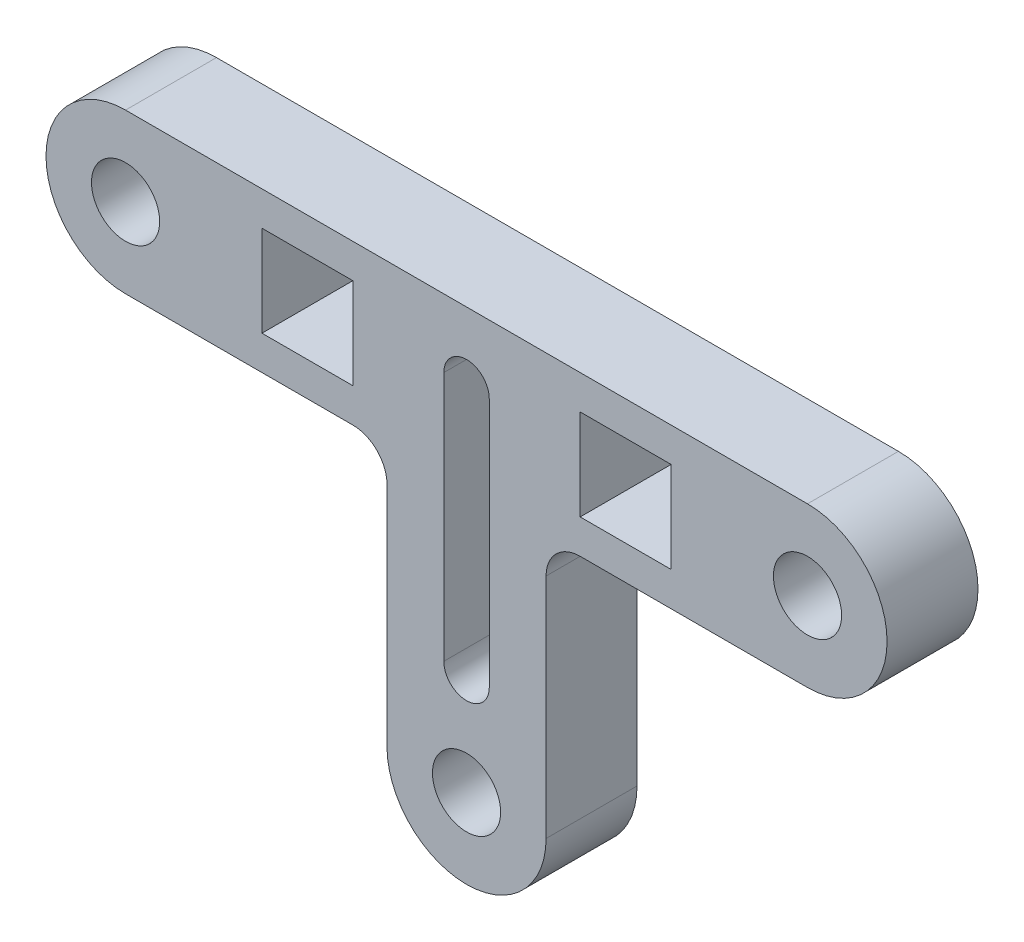
ISO-10303-21;
HEADER;
FILE_DESCRIPTION(('STEP AP214'),'2;1');
FILE_NAME('part.step','',(''),(''),'','','');
FILE_SCHEMA(('AUTOMOTIVE_DESIGN { 1 0 10303 214 1 1 1 1 }'));
ENDSEC;
DATA;
#1=APPLICATION_CONTEXT('core data for automotive mechanical design processes');
#2=APPLICATION_PROTOCOL_DEFINITION('international standard','automotive_design',2000,#1);
#3=PRODUCT_CONTEXT('',#1,'mechanical');
#4=PRODUCT('Part','Part','',(#3));
#5=PRODUCT_RELATED_PRODUCT_CATEGORY('part','',(#4));
#6=PRODUCT_DEFINITION_FORMATION('','',#4);
#7=PRODUCT_DEFINITION_CONTEXT('part definition',#1,'design');
#8=PRODUCT_DEFINITION('design','',#6,#7);
#9=PRODUCT_DEFINITION_SHAPE('','',#8);
#10=(LENGTH_UNIT() NAMED_UNIT(*) SI_UNIT(.MILLI.,.METRE.));
#11=(NAMED_UNIT(*) PLANE_ANGLE_UNIT() SI_UNIT($,.RADIAN.));
#12=(NAMED_UNIT(*) SI_UNIT($,.STERADIAN.) SOLID_ANGLE_UNIT());
#13=UNCERTAINTY_MEASURE_WITH_UNIT(LENGTH_MEASURE(1.E-05),#10,'distance_accuracy_value','');
#14=(GEOMETRIC_REPRESENTATION_CONTEXT(3) GLOBAL_UNCERTAINTY_ASSIGNED_CONTEXT((#13)) GLOBAL_UNIT_ASSIGNED_CONTEXT((#10,
#11,#12)) REPRESENTATION_CONTEXT('',''));
#15=CARTESIAN_POINT('',(0.,0.,0.));
#16=DIRECTION('',(0.,0.,1.));
#17=DIRECTION('',(1.,0.,0.));
#18=AXIS2_PLACEMENT_3D('',#15,#16,#17);
#19=CARTESIAN_POINT('',(0.,0.,4.));
#20=DIRECTION('',(0.,0.,-1.));
#21=DIRECTION('',(-1.,0.,0.));
#22=AXIS2_PLACEMENT_3D('',#19,#20,#21);
#23=PLANE('',#22);
#24=DIRECTION('',(0.,1.,0.));
#25=VECTOR('',#24,1.);
#26=CARTESIAN_POINT('',(1.,4.5,4.));
#27=LINE('',#26,#25);
#28=CARTESIAN_POINT('',(1.,4.5,4.));
#29=VERTEX_POINT('',#28);
#30=CARTESIAN_POINT('',(1.,15.5,4.));
#31=VERTEX_POINT('',#30);
#32=EDGE_CURVE('E207',#29,#31,#27,.T.);
#33=ORIENTED_EDGE('',*,*,#32,.F.);
#34=CARTESIAN_POINT('',(0.,4.5,4.));
#35=DIRECTION('',(0.,0.,1.));
#36=DIRECTION('',(1.,0.,0.));
#37=AXIS2_PLACEMENT_3D('',#34,#35,#36);
#38=CIRCLE('',#37,1.);
#39=CARTESIAN_POINT('',(-1.,4.5,4.));
#40=VERTEX_POINT('',#39);
#41=EDGE_CURVE('E54',#40,#29,#38,.T.);
#42=ORIENTED_EDGE('',*,*,#41,.F.);
#43=DIRECTION('',(0.,-1.,0.));
#44=VECTOR('',#43,1.);
#45=CARTESIAN_POINT('',(-1.,4.5,4.));
#46=LINE('',#45,#44);
#47=CARTESIAN_POINT('',(-1.,15.5,4.));
#48=VERTEX_POINT('',#47);
#49=EDGE_CURVE('E200',#48,#40,#46,.T.);
#50=ORIENTED_EDGE('',*,*,#49,.F.);
#51=CARTESIAN_POINT('',(0.,15.5,4.));
#52=DIRECTION('',(0.,0.,1.));
#53=DIRECTION('',(1.,0.,0.));
#54=AXIS2_PLACEMENT_3D('',#51,#52,#53);
#55=CIRCLE('',#54,1.);
#56=EDGE_CURVE('E214',#31,#48,#55,.T.);
#57=ORIENTED_EDGE('',*,*,#56,.F.);
#58=EDGE_LOOP('',(#33,#42,#50,#57));
#59=FACE_BOUND('',#58,.T.);
#60=CARTESIAN_POINT('',(0.,0.,4.));
#61=DIRECTION('',(0.,0.,1.));
#62=DIRECTION('',(1.,0.,0.));
#63=AXIS2_PLACEMENT_3D('',#60,#61,#62);
#64=CIRCLE('',#63,1.5);
#65=CARTESIAN_POINT('',(1.5,0.,4.));
#66=VERTEX_POINT('',#65);
#67=EDGE_CURVE('E254',#66,#66,#64,.T.);
#68=ORIENTED_EDGE('',*,*,#67,.F.);
#69=EDGE_LOOP('',(#68));
#70=FACE_BOUND('',#69,.T.);
#71=DIRECTION('',(0.,-1.,0.));
#72=VECTOR('',#71,1.);
#73=CARTESIAN_POINT('',(-9.,17.,4.));
#74=LINE('',#73,#72);
#75=CARTESIAN_POINT('',(-9.,17.,4.));
#76=VERTEX_POINT('',#75);
#77=CARTESIAN_POINT('',(-8.99999999999999,13.,4.));
#78=VERTEX_POINT('',#77);
#79=EDGE_CURVE('E260',#76,#78,#74,.T.);
#80=ORIENTED_EDGE('',*,*,#79,.F.);
#81=DIRECTION('',(-1.,0.,0.));
#82=VECTOR('',#81,1.);
#83=CARTESIAN_POINT('',(-5.00000000000001,17.,4.));
#84=LINE('',#83,#82);
#85=CARTESIAN_POINT('',(-5.00000000000001,17.,4.));
#86=VERTEX_POINT('',#85);
#87=EDGE_CURVE('E268',#86,#76,#84,.T.);
#88=ORIENTED_EDGE('',*,*,#87,.F.);
#89=DIRECTION('',(0.,1.,0.));
#90=VECTOR('',#89,1.);
#91=CARTESIAN_POINT('',(-5.00000000000001,17.,4.));
#92=LINE('',#91,#90);
#93=CARTESIAN_POINT('',(-5.00000000000004,13.,4.));
#94=VERTEX_POINT('',#93);
#95=EDGE_CURVE('E265',#94,#86,#92,.T.);
#96=ORIENTED_EDGE('',*,*,#95,.F.);
#97=DIRECTION('',(1.,0.,0.));
#98=VECTOR('',#97,1.);
#99=CARTESIAN_POINT('',(-5.00000000000004,13.,4.));
#100=LINE('',#99,#98);
#101=EDGE_CURVE('E262',#78,#94,#100,.T.);
#102=ORIENTED_EDGE('',*,*,#101,.F.);
#103=EDGE_LOOP('',(#80,#88,#96,#102));
#104=FACE_BOUND('',#103,.T.);
#105=CARTESIAN_POINT('',(0.,0.,4.));
#106=DIRECTION('',(0.,0.,1.));
#107=DIRECTION('',(-1.,0.,0.));
#108=AXIS2_PLACEMENT_3D('',#105,#106,#107);
#109=CIRCLE('',#108,3.5);
#110=CARTESIAN_POINT('',(-3.5,0.,4.));
#111=VERTEX_POINT('',#110);
#112=CARTESIAN_POINT('',(3.5,0.,4.));
#113=VERTEX_POINT('',#112);
#114=EDGE_CURVE('E303',#111,#113,#109,.T.);
#115=ORIENTED_EDGE('',*,*,#114,.T.);
#116=DIRECTION('',(0.,1.,0.));
#117=VECTOR('',#116,1.);
#118=CARTESIAN_POINT('',(3.5,0.,4.));
#119=LINE('',#118,#117);
#120=CARTESIAN_POINT('',(3.5,10.,4.));
#121=VERTEX_POINT('',#120);
#122=EDGE_CURVE('E306',#113,#121,#119,.T.);
#123=ORIENTED_EDGE('',*,*,#122,.T.);
#124=CARTESIAN_POINT('',(5.,10.,4.));
#125=DIRECTION('',(0.,0.,-1.));
#126=DIRECTION('',(1.,0.,0.));
#127=AXIS2_PLACEMENT_3D('',#124,#125,#126);
#128=CIRCLE('',#127,1.5);
#129=CARTESIAN_POINT('',(5.,11.5,4.));
#130=VERTEX_POINT('',#129);
#131=EDGE_CURVE('E309',#121,#130,#128,.T.);
#132=ORIENTED_EDGE('',*,*,#131,.T.);
#133=DIRECTION('',(1.,0.,0.));
#134=VECTOR('',#133,1.);
#135=CARTESIAN_POINT('',(15.,11.5,4.));
#136=LINE('',#135,#134);
#137=CARTESIAN_POINT('',(15.,11.5,4.));
#138=VERTEX_POINT('',#137);
#139=EDGE_CURVE('E311',#130,#138,#136,.T.);
#140=ORIENTED_EDGE('',*,*,#139,.T.);
#141=CARTESIAN_POINT('',(15.,15.,4.));
#142=DIRECTION('',(0.,0.,1.));
#143=DIRECTION('',(-1.,0.,0.));
#144=AXIS2_PLACEMENT_3D('',#141,#142,#143);
#145=CIRCLE('',#144,3.5);
#146=CARTESIAN_POINT('',(15.,18.5,4.));
#147=VERTEX_POINT('',#146);
#148=EDGE_CURVE('E313',#138,#147,#145,.T.);
#149=ORIENTED_EDGE('',*,*,#148,.T.);
#150=DIRECTION('',(-1.,0.,0.));
#151=VECTOR('',#150,1.);
#152=CARTESIAN_POINT('',(-15.,18.5,4.));
#153=LINE('',#152,#151);
#154=CARTESIAN_POINT('',(-15.,18.5,4.));
#155=VERTEX_POINT('',#154);
#156=EDGE_CURVE('E315',#147,#155,#153,.T.);
#157=ORIENTED_EDGE('',*,*,#156,.T.);
#158=CARTESIAN_POINT('',(-15.,15.,4.));
#159=DIRECTION('',(0.,0.,1.));
#160=DIRECTION('',(-1.,0.,0.));
#161=AXIS2_PLACEMENT_3D('',#158,#159,#160);
#162=CIRCLE('',#161,3.5);
#163=CARTESIAN_POINT('',(-15.,11.5,4.));
#164=VERTEX_POINT('',#163);
#165=EDGE_CURVE('E317',#155,#164,#162,.T.);
#166=ORIENTED_EDGE('',*,*,#165,.T.);
#167=DIRECTION('',(1.,0.,0.));
#168=VECTOR('',#167,1.);
#169=CARTESIAN_POINT('',(-5.,11.5,4.));
#170=LINE('',#169,#168);
#171=CARTESIAN_POINT('',(-5.,11.5,4.));
#172=VERTEX_POINT('',#171);
#173=EDGE_CURVE('E319',#164,#172,#170,.T.);
#174=ORIENTED_EDGE('',*,*,#173,.T.);
#175=CARTESIAN_POINT('',(-5.,10.,4.));
#176=DIRECTION('',(0.,0.,-1.));
#177=DIRECTION('',(1.,0.,0.));
#178=AXIS2_PLACEMENT_3D('',#175,#176,#177);
#179=CIRCLE('',#178,1.5);
#180=CARTESIAN_POINT('',(-3.5,10.,4.));
#181=VERTEX_POINT('',#180);
#182=EDGE_CURVE('E321',#172,#181,#179,.T.);
#183=ORIENTED_EDGE('',*,*,#182,.T.);
#184=DIRECTION('',(0.,-1.,0.));
#185=VECTOR('',#184,1.);
#186=CARTESIAN_POINT('',(-3.5,0.,4.));
#187=LINE('',#186,#185);
#188=EDGE_CURVE('E323',#181,#111,#187,.T.);
#189=ORIENTED_EDGE('',*,*,#188,.T.);
#190=EDGE_LOOP('',(#115,#123,#132,#140,#149,#157,#166,#174,#183,#189));
#191=FACE_BOUND('',#190,.T.);
#192=CARTESIAN_POINT('',(-15.,15.,4.));
#193=DIRECTION('',(0.,0.,1.));
#194=DIRECTION('',(1.,0.,0.));
#195=AXIS2_PLACEMENT_3D('',#192,#193,#194);
#196=CIRCLE('',#195,1.5);
#197=CARTESIAN_POINT('',(-13.5,15.,4.));
#198=VERTEX_POINT('',#197);
#199=EDGE_CURVE('E297',#198,#198,#196,.T.);
#200=ORIENTED_EDGE('',*,*,#199,.F.);
#201=EDGE_LOOP('',(#200));
#202=FACE_BOUND('',#201,.T.);
#203=CARTESIAN_POINT('',(15.,15.,4.));
#204=DIRECTION('',(0.,0.,1.));
#205=DIRECTION('',(1.,0.,0.));
#206=AXIS2_PLACEMENT_3D('',#203,#204,#205);
#207=CIRCLE('',#206,1.5);
#208=CARTESIAN_POINT('',(16.5,15.,4.));
#209=VERTEX_POINT('',#208);
#210=EDGE_CURVE('E291',#209,#209,#207,.T.);
#211=ORIENTED_EDGE('',*,*,#210,.F.);
#212=EDGE_LOOP('',(#211));
#213=FACE_BOUND('',#212,.T.);
#214=DIRECTION('',(0.,-1.,0.));
#215=VECTOR('',#214,1.);
#216=CARTESIAN_POINT('',(5.00000000000002,17.,4.));
#217=LINE('',#216,#215);
#218=CARTESIAN_POINT('',(5.00000000000002,17.,4.));
#219=VERTEX_POINT('',#218);
#220=CARTESIAN_POINT('',(5.00000000000002,13.,4.));
#221=VERTEX_POINT('',#220);
#222=EDGE_CURVE('E223',#219,#221,#217,.T.);
#223=ORIENTED_EDGE('',*,*,#222,.F.);
#224=DIRECTION('',(-1.,0.,0.));
#225=VECTOR('',#224,1.);
#226=CARTESIAN_POINT('',(9.00000000000001,17.,4.));
#227=LINE('',#226,#225);
#228=CARTESIAN_POINT('',(9.00000000000001,17.,4.));
#229=VERTEX_POINT('',#228);
#230=EDGE_CURVE('E231',#229,#219,#227,.T.);
#231=ORIENTED_EDGE('',*,*,#230,.F.);
#232=DIRECTION('',(0.,1.,0.));
#233=VECTOR('',#232,1.);
#234=CARTESIAN_POINT('',(9.00000000000001,17.,4.));
#235=LINE('',#234,#233);
#236=CARTESIAN_POINT('',(9.00000000000002,13.,4.));
#237=VERTEX_POINT('',#236);
#238=EDGE_CURVE('E228',#237,#229,#235,.T.);
#239=ORIENTED_EDGE('',*,*,#238,.F.);
#240=DIRECTION('',(1.,0.,0.));
#241=VECTOR('',#240,1.);
#242=CARTESIAN_POINT('',(9.00000000000002,13.,4.));
#243=LINE('',#242,#241);
#244=EDGE_CURVE('E225',#221,#237,#243,.T.);
#245=ORIENTED_EDGE('',*,*,#244,.F.);
#246=EDGE_LOOP('',(#223,#231,#239,#245));
#247=FACE_BOUND('',#246,.T.);
#248=ADVANCED_FACE('F39',(#59,#70,#104,#191,#202,#213,#247),#23,.F.);
#249=CARTESIAN_POINT('',(0.,0.,0.));
#250=DIRECTION('',(0.,0.,-1.));
#251=DIRECTION('',(-1.,0.,0.));
#252=AXIS2_PLACEMENT_3D('',#249,#250,#251);
#253=PLANE('',#252);
#254=CARTESIAN_POINT('',(0.,4.5,0.));
#255=DIRECTION('',(0.,0.,-1.));
#256=DIRECTION('',(-1.,0.,0.));
#257=AXIS2_PLACEMENT_3D('',#254,#255,#256);
#258=CIRCLE('',#257,1.);
#259=CARTESIAN_POINT('',(-1.,4.5,0.));
#260=VERTEX_POINT('',#259);
#261=CARTESIAN_POINT('',(1.,4.5,0.));
#262=VERTEX_POINT('',#261);
#263=EDGE_CURVE('E198',#260,#262,#258,.F.);
#264=ORIENTED_EDGE('',*,*,#263,.T.);
#265=DIRECTION('',(0.,1.,0.));
#266=VECTOR('',#265,1.);
#267=CARTESIAN_POINT('',(1.,4.5,0.));
#268=LINE('',#267,#266);
#269=CARTESIAN_POINT('',(1.,15.5,0.));
#270=VERTEX_POINT('',#269);
#271=EDGE_CURVE('E187',#262,#270,#268,.T.);
#272=ORIENTED_EDGE('',*,*,#271,.T.);
#273=CARTESIAN_POINT('',(0.,15.5,0.));
#274=DIRECTION('',(0.,0.,-1.));
#275=DIRECTION('',(-1.,0.,0.));
#276=AXIS2_PLACEMENT_3D('',#273,#274,#275);
#277=CIRCLE('',#276,1.);
#278=CARTESIAN_POINT('',(-1.,15.5,0.));
#279=VERTEX_POINT('',#278);
#280=EDGE_CURVE('E209',#270,#279,#277,.F.);
#281=ORIENTED_EDGE('',*,*,#280,.T.);
#282=DIRECTION('',(0.,-1.,0.));
#283=VECTOR('',#282,1.);
#284=CARTESIAN_POINT('',(-1.,4.5,0.));
#285=LINE('',#284,#283);
#286=EDGE_CURVE('E205',#279,#260,#285,.T.);
#287=ORIENTED_EDGE('',*,*,#286,.T.);
#288=EDGE_LOOP('',(#264,#272,#281,#287));
#289=FACE_BOUND('',#288,.T.);
#290=DIRECTION('',(-1.,0.,0.));
#291=VECTOR('',#290,1.);
#292=CARTESIAN_POINT('',(-5.00000000000001,17.,0.));
#293=LINE('',#292,#291);
#294=CARTESIAN_POINT('',(-5.00000000000001,17.,0.));
#295=VERTEX_POINT('',#294);
#296=CARTESIAN_POINT('',(-9.,17.,0.));
#297=VERTEX_POINT('',#296);
#298=EDGE_CURVE('E263',#295,#297,#293,.T.);
#299=ORIENTED_EDGE('',*,*,#298,.T.);
#300=DIRECTION('',(0.,-1.,0.));
#301=VECTOR('',#300,1.);
#302=CARTESIAN_POINT('',(-9.,17.,0.));
#303=LINE('',#302,#301);
#304=CARTESIAN_POINT('',(-8.99999999999999,13.,0.));
#305=VERTEX_POINT('',#304);
#306=EDGE_CURVE('E257',#297,#305,#303,.T.);
#307=ORIENTED_EDGE('',*,*,#306,.T.);
#308=DIRECTION('',(1.,0.,0.));
#309=VECTOR('',#308,1.);
#310=CARTESIAN_POINT('',(-5.00000000000004,13.,0.));
#311=LINE('',#310,#309);
#312=CARTESIAN_POINT('',(-5.00000000000004,13.,0.));
#313=VERTEX_POINT('',#312);
#314=EDGE_CURVE('E273',#305,#313,#311,.T.);
#315=ORIENTED_EDGE('',*,*,#314,.T.);
#316=DIRECTION('',(0.,1.,0.));
#317=VECTOR('',#316,1.);
#318=CARTESIAN_POINT('',(-5.00000000000001,17.,0.));
#319=LINE('',#318,#317);
#320=EDGE_CURVE('E276',#313,#295,#319,.T.);
#321=ORIENTED_EDGE('',*,*,#320,.T.);
#322=EDGE_LOOP('',(#299,#307,#315,#321));
#323=FACE_BOUND('',#322,.T.);
#324=CARTESIAN_POINT('',(15.,15.,0.));
#325=DIRECTION('',(0.,0.,1.));
#326=DIRECTION('',(1.,0.,0.));
#327=AXIS2_PLACEMENT_3D('',#324,#325,#326);
#328=CIRCLE('',#327,1.5);
#329=CARTESIAN_POINT('',(16.5,15.,0.));
#330=VERTEX_POINT('',#329);
#331=EDGE_CURVE('E290',#330,#330,#328,.T.);
#332=ORIENTED_EDGE('',*,*,#331,.T.);
#333=EDGE_LOOP('',(#332));
#334=FACE_BOUND('',#333,.T.);
#335=CARTESIAN_POINT('',(0.,0.,0.));
#336=DIRECTION('',(0.,0.,1.));
#337=DIRECTION('',(-1.,0.,0.));
#338=AXIS2_PLACEMENT_3D('',#335,#336,#337);
#339=CIRCLE('',#338,3.5);
#340=CARTESIAN_POINT('',(-3.5,0.,0.));
#341=VERTEX_POINT('',#340);
#342=CARTESIAN_POINT('',(3.5,0.,0.));
#343=VERTEX_POINT('',#342);
#344=EDGE_CURVE('E300',#341,#343,#339,.T.);
#345=ORIENTED_EDGE('',*,*,#344,.F.);
#346=DIRECTION('',(0.,-1.,0.));
#347=VECTOR('',#346,1.);
#348=CARTESIAN_POINT('',(-3.5,0.,0.));
#349=LINE('',#348,#347);
#350=CARTESIAN_POINT('',(-3.5,10.,0.));
#351=VERTEX_POINT('',#350);
#352=EDGE_CURVE('E307',#351,#341,#349,.T.);
#353=ORIENTED_EDGE('',*,*,#352,.F.);
#354=CARTESIAN_POINT('',(-5.,10.,0.));
#355=DIRECTION('',(0.,0.,-1.));
#356=DIRECTION('',(1.,0.,0.));
#357=AXIS2_PLACEMENT_3D('',#354,#355,#356);
#358=CIRCLE('',#357,1.5);
#359=CARTESIAN_POINT('',(-5.,11.5,0.));
#360=VERTEX_POINT('',#359);
#361=EDGE_CURVE('E342',#360,#351,#358,.T.);
#362=ORIENTED_EDGE('',*,*,#361,.F.);
#363=DIRECTION('',(1.,0.,0.));
#364=VECTOR('',#363,1.);
#365=CARTESIAN_POINT('',(-5.,11.5,0.));
#366=LINE('',#365,#364);
#367=CARTESIAN_POINT('',(-15.,11.5,0.));
#368=VERTEX_POINT('',#367);
#369=EDGE_CURVE('E340',#368,#360,#366,.T.);
#370=ORIENTED_EDGE('',*,*,#369,.F.);
#371=CARTESIAN_POINT('',(-15.,15.,0.));
#372=DIRECTION('',(0.,0.,1.));
#373=DIRECTION('',(-1.,0.,0.));
#374=AXIS2_PLACEMENT_3D('',#371,#372,#373);
#375=CIRCLE('',#374,3.5);
#376=CARTESIAN_POINT('',(-15.,18.5,0.));
#377=VERTEX_POINT('',#376);
#378=EDGE_CURVE('E338',#377,#368,#375,.T.);
#379=ORIENTED_EDGE('',*,*,#378,.F.);
#380=DIRECTION('',(-1.,0.,0.));
#381=VECTOR('',#380,1.);
#382=CARTESIAN_POINT('',(-15.,18.5,0.));
#383=LINE('',#382,#381);
#384=CARTESIAN_POINT('',(15.,18.5,0.));
#385=VERTEX_POINT('',#384);
#386=EDGE_CURVE('E336',#385,#377,#383,.T.);
#387=ORIENTED_EDGE('',*,*,#386,.F.);
#388=CARTESIAN_POINT('',(15.,15.,0.));
#389=DIRECTION('',(0.,0.,1.));
#390=DIRECTION('',(-1.,0.,0.));
#391=AXIS2_PLACEMENT_3D('',#388,#389,#390);
#392=CIRCLE('',#391,3.5);
#393=CARTESIAN_POINT('',(15.,11.5,0.));
#394=VERTEX_POINT('',#393);
#395=EDGE_CURVE('E334',#394,#385,#392,.T.);
#396=ORIENTED_EDGE('',*,*,#395,.F.);
#397=DIRECTION('',(1.,0.,0.));
#398=VECTOR('',#397,1.);
#399=CARTESIAN_POINT('',(15.,11.5,0.));
#400=LINE('',#399,#398);
#401=CARTESIAN_POINT('',(5.,11.5,0.));
#402=VERTEX_POINT('',#401);
#403=EDGE_CURVE('E332',#402,#394,#400,.T.);
#404=ORIENTED_EDGE('',*,*,#403,.F.);
#405=CARTESIAN_POINT('',(5.,10.,0.));
#406=DIRECTION('',(0.,0.,-1.));
#407=DIRECTION('',(1.,0.,0.));
#408=AXIS2_PLACEMENT_3D('',#405,#406,#407);
#409=CIRCLE('',#408,1.5);
#410=CARTESIAN_POINT('',(3.5,10.,0.));
#411=VERTEX_POINT('',#410);
#412=EDGE_CURVE('E330',#411,#402,#409,.T.);
#413=ORIENTED_EDGE('',*,*,#412,.F.);
#414=DIRECTION('',(0.,1.,0.));
#415=VECTOR('',#414,1.);
#416=CARTESIAN_POINT('',(3.5,0.,0.));
#417=LINE('',#416,#415);
#418=EDGE_CURVE('E328',#343,#411,#417,.T.);
#419=ORIENTED_EDGE('',*,*,#418,.F.);
#420=EDGE_LOOP('',(#345,#353,#362,#370,#379,#387,#396,#404,#413,#419));
#421=FACE_BOUND('',#420,.T.);
#422=CARTESIAN_POINT('',(-15.,15.,0.));
#423=DIRECTION('',(0.,0.,1.));
#424=DIRECTION('',(1.,0.,0.));
#425=AXIS2_PLACEMENT_3D('',#422,#423,#424);
#426=CIRCLE('',#425,1.5);
#427=CARTESIAN_POINT('',(-13.5,15.,0.));
#428=VERTEX_POINT('',#427);
#429=EDGE_CURVE('E294',#428,#428,#426,.T.);
#430=ORIENTED_EDGE('',*,*,#429,.T.);
#431=EDGE_LOOP('',(#430));
#432=FACE_BOUND('',#431,.T.);
#433=CARTESIAN_POINT('',(0.,0.,0.));
#434=DIRECTION('',(0.,0.,1.));
#435=DIRECTION('',(1.,0.,0.));
#436=AXIS2_PLACEMENT_3D('',#433,#434,#435);
#437=CIRCLE('',#436,1.5);
#438=CARTESIAN_POINT('',(1.5,0.,0.));
#439=VERTEX_POINT('',#438);
#440=EDGE_CURVE('E253',#439,#439,#437,.T.);
#441=ORIENTED_EDGE('',*,*,#440,.T.);
#442=EDGE_LOOP('',(#441));
#443=FACE_BOUND('',#442,.T.);
#444=DIRECTION('',(-1.,0.,0.));
#445=VECTOR('',#444,1.);
#446=CARTESIAN_POINT('',(9.00000000000001,17.,0.));
#447=LINE('',#446,#445);
#448=CARTESIAN_POINT('',(9.00000000000001,17.,0.));
#449=VERTEX_POINT('',#448);
#450=CARTESIAN_POINT('',(5.00000000000002,17.,0.));
#451=VERTEX_POINT('',#450);
#452=EDGE_CURVE('E226',#449,#451,#447,.T.);
#453=ORIENTED_EDGE('',*,*,#452,.T.);
#454=DIRECTION('',(0.,-1.,0.));
#455=VECTOR('',#454,1.);
#456=CARTESIAN_POINT('',(5.00000000000002,17.,0.));
#457=LINE('',#456,#455);
#458=CARTESIAN_POINT('',(5.00000000000002,13.,0.));
#459=VERTEX_POINT('',#458);
#460=EDGE_CURVE('E194',#451,#459,#457,.T.);
#461=ORIENTED_EDGE('',*,*,#460,.T.);
#462=DIRECTION('',(1.,0.,0.));
#463=VECTOR('',#462,1.);
#464=CARTESIAN_POINT('',(9.00000000000002,13.,0.));
#465=LINE('',#464,#463);
#466=CARTESIAN_POINT('',(9.00000000000002,13.,0.));
#467=VERTEX_POINT('',#466);
#468=EDGE_CURVE('E236',#459,#467,#465,.T.);
#469=ORIENTED_EDGE('',*,*,#468,.T.);
#470=DIRECTION('',(0.,1.,0.));
#471=VECTOR('',#470,1.);
#472=CARTESIAN_POINT('',(9.00000000000001,17.,0.));
#473=LINE('',#472,#471);
#474=EDGE_CURVE('E239',#467,#449,#473,.T.);
#475=ORIENTED_EDGE('',*,*,#474,.T.);
#476=EDGE_LOOP('',(#453,#461,#469,#475));
#477=FACE_BOUND('',#476,.T.);
#478=ADVANCED_FACE('F203',(#289,#323,#334,#421,#432,#443,#477),#253,.T.);
#479=CARTESIAN_POINT('',(0.,0.,4.));
#480=DIRECTION('',(0.,0.,-1.));
#481=DIRECTION('',(-1.,0.,0.));
#482=AXIS2_PLACEMENT_3D('',#479,#480,#481);
#483=CYLINDRICAL_SURFACE('',#482,3.5);
#484=ORIENTED_EDGE('',*,*,#344,.T.);
#485=DIRECTION('',(0.,0.,-1.));
#486=VECTOR('',#485,1.);
#487=CARTESIAN_POINT('',(3.5,0.,4.));
#488=LINE('',#487,#486);
#489=EDGE_CURVE('E11',#113,#343,#488,.T.);
#490=ORIENTED_EDGE('',*,*,#489,.F.);
#491=ORIENTED_EDGE('',*,*,#114,.F.);
#492=DIRECTION('',(0.,0.,-1.));
#493=VECTOR('',#492,1.);
#494=CARTESIAN_POINT('',(-3.5,0.,4.));
#495=LINE('',#494,#493);
#496=EDGE_CURVE('E325',#111,#341,#495,.T.);
#497=ORIENTED_EDGE('',*,*,#496,.T.);
#498=EDGE_LOOP('',(#484,#490,#491,#497));
#499=FACE_BOUND('',#498,.T.);
#500=ADVANCED_FACE('F41',(#499),#483,.T.);
#501=CARTESIAN_POINT('',(3.5,0.,4.));
#502=DIRECTION('',(-1.,0.,0.));
#503=DIRECTION('',(0.,0.,1.));
#504=AXIS2_PLACEMENT_3D('',#501,#502,#503);
#505=PLANE('',#504);
#506=ORIENTED_EDGE('',*,*,#418,.T.);
#507=DIRECTION('',(0.,0.,-1.));
#508=VECTOR('',#507,1.);
#509=CARTESIAN_POINT('',(3.5,10.,4.));
#510=LINE('',#509,#508);
#511=EDGE_CURVE('E47',#121,#411,#510,.T.);
#512=ORIENTED_EDGE('',*,*,#511,.F.);
#513=ORIENTED_EDGE('',*,*,#122,.F.);
#514=ORIENTED_EDGE('',*,*,#489,.T.);
#515=EDGE_LOOP('',(#506,#512,#513,#514));
#516=FACE_BOUND('',#515,.T.);
#517=ADVANCED_FACE('F395',(#516),#505,.F.);
#518=CARTESIAN_POINT('',(5.,10.,4.));
#519=DIRECTION('',(0.,0.,-1.));
#520=DIRECTION('',(-1.,0.,0.));
#521=AXIS2_PLACEMENT_3D('',#518,#519,#520);
#522=CYLINDRICAL_SURFACE('',#521,1.5);
#523=ORIENTED_EDGE('',*,*,#412,.T.);
#524=DIRECTION('',(0.,0.,-1.));
#525=VECTOR('',#524,1.);
#526=CARTESIAN_POINT('',(5.,11.5,4.));
#527=LINE('',#526,#525);
#528=EDGE_CURVE('E365',#130,#402,#527,.T.);
#529=ORIENTED_EDGE('',*,*,#528,.F.);
#530=ORIENTED_EDGE('',*,*,#131,.F.);
#531=ORIENTED_EDGE('',*,*,#511,.T.);
#532=EDGE_LOOP('',(#523,#529,#530,#531));
#533=FACE_BOUND('',#532,.T.);
#534=ADVANCED_FACE('F372',(#533),#522,.F.);
#535=CARTESIAN_POINT('',(15.,11.5,4.));
#536=DIRECTION('',(0.,1.,0.));
#537=DIRECTION('',(-1.,0.,0.));
#538=AXIS2_PLACEMENT_3D('',#535,#536,#537);
#539=PLANE('',#538);
#540=ORIENTED_EDGE('',*,*,#403,.T.);
#541=DIRECTION('',(0.,0.,-1.));
#542=VECTOR('',#541,1.);
#543=CARTESIAN_POINT('',(15.,11.5,4.));
#544=LINE('',#543,#542);
#545=EDGE_CURVE('E362',#138,#394,#544,.T.);
#546=ORIENTED_EDGE('',*,*,#545,.F.);
#547=ORIENTED_EDGE('',*,*,#139,.F.);
#548=ORIENTED_EDGE('',*,*,#528,.T.);
#549=EDGE_LOOP('',(#540,#546,#547,#548));
#550=FACE_BOUND('',#549,.T.);
#551=ADVANCED_FACE('F383',(#550),#539,.F.);
#552=CARTESIAN_POINT('',(15.,15.,4.));
#553=DIRECTION('',(0.,0.,-1.));
#554=DIRECTION('',(-1.,0.,0.));
#555=AXIS2_PLACEMENT_3D('',#552,#553,#554);
#556=CYLINDRICAL_SURFACE('',#555,3.5);
#557=ORIENTED_EDGE('',*,*,#395,.T.);
#558=DIRECTION('',(0.,0.,-1.));
#559=VECTOR('',#558,1.);
#560=CARTESIAN_POINT('',(15.,18.5,4.));
#561=LINE('',#560,#559);
#562=EDGE_CURVE('E359',#147,#385,#561,.T.);
#563=ORIENTED_EDGE('',*,*,#562,.F.);
#564=ORIENTED_EDGE('',*,*,#148,.F.);
#565=ORIENTED_EDGE('',*,*,#545,.T.);
#566=EDGE_LOOP('',(#557,#563,#564,#565));
#567=FACE_BOUND('',#566,.T.);
#568=ADVANCED_FACE('F387',(#567),#556,.T.);
#569=CARTESIAN_POINT('',(-15.,18.5,4.));
#570=DIRECTION('',(0.,-1.,0.));
#571=DIRECTION('',(0.,0.,-1.));
#572=AXIS2_PLACEMENT_3D('',#569,#570,#571);
#573=PLANE('',#572);
#574=ORIENTED_EDGE('',*,*,#386,.T.);
#575=DIRECTION('',(0.,0.,-1.));
#576=VECTOR('',#575,1.);
#577=CARTESIAN_POINT('',(-15.,18.5,4.));
#578=LINE('',#577,#576);
#579=EDGE_CURVE('E356',#155,#377,#578,.T.);
#580=ORIENTED_EDGE('',*,*,#579,.F.);
#581=ORIENTED_EDGE('',*,*,#156,.F.);
#582=ORIENTED_EDGE('',*,*,#562,.T.);
#583=EDGE_LOOP('',(#574,#580,#581,#582));
#584=FACE_BOUND('',#583,.T.);
#585=ADVANCED_FACE('F418',(#584),#573,.F.);
#586=CARTESIAN_POINT('',(-15.,15.,4.));
#587=DIRECTION('',(0.,0.,-1.));
#588=DIRECTION('',(-1.,0.,0.));
#589=AXIS2_PLACEMENT_3D('',#586,#587,#588);
#590=CYLINDRICAL_SURFACE('',#589,3.5);
#591=ORIENTED_EDGE('',*,*,#378,.T.);
#592=DIRECTION('',(0.,0.,-1.));
#593=VECTOR('',#592,1.);
#594=CARTESIAN_POINT('',(-15.,11.5,4.));
#595=LINE('',#594,#593);
#596=EDGE_CURVE('E353',#164,#368,#595,.T.);
#597=ORIENTED_EDGE('',*,*,#596,.F.);
#598=ORIENTED_EDGE('',*,*,#165,.F.);
#599=ORIENTED_EDGE('',*,*,#579,.T.);
#600=EDGE_LOOP('',(#591,#597,#598,#599));
#601=FACE_BOUND('',#600,.T.);
#602=ADVANCED_FACE('F415',(#601),#590,.T.);
#603=CARTESIAN_POINT('',(-5.,11.5,4.));
#604=DIRECTION('',(0.,1.,0.));
#605=DIRECTION('',(-1.,0.,0.));
#606=AXIS2_PLACEMENT_3D('',#603,#604,#605);
#607=PLANE('',#606);
#608=ORIENTED_EDGE('',*,*,#369,.T.);
#609=DIRECTION('',(0.,0.,-1.));
#610=VECTOR('',#609,1.);
#611=CARTESIAN_POINT('',(-5.,11.5,4.));
#612=LINE('',#611,#610);
#613=EDGE_CURVE('E350',#172,#360,#612,.T.);
#614=ORIENTED_EDGE('',*,*,#613,.F.);
#615=ORIENTED_EDGE('',*,*,#173,.F.);
#616=ORIENTED_EDGE('',*,*,#596,.T.);
#617=EDGE_LOOP('',(#608,#614,#615,#616));
#618=FACE_BOUND('',#617,.T.);
#619=ADVANCED_FACE('F411',(#618),#607,.F.);
#620=CARTESIAN_POINT('',(-5.,10.,4.));
#621=DIRECTION('',(0.,0.,-1.));
#622=DIRECTION('',(-1.,0.,0.));
#623=AXIS2_PLACEMENT_3D('',#620,#621,#622);
#624=CYLINDRICAL_SURFACE('',#623,1.5);
#625=ORIENTED_EDGE('',*,*,#361,.T.);
#626=DIRECTION('',(0.,0.,-1.));
#627=VECTOR('',#626,1.);
#628=CARTESIAN_POINT('',(-3.5,10.,4.));
#629=LINE('',#628,#627);
#630=EDGE_CURVE('E347',#181,#351,#629,.T.);
#631=ORIENTED_EDGE('',*,*,#630,.F.);
#632=ORIENTED_EDGE('',*,*,#182,.F.);
#633=ORIENTED_EDGE('',*,*,#613,.T.);
#634=EDGE_LOOP('',(#625,#631,#632,#633));
#635=FACE_BOUND('',#634,.T.);
#636=ADVANCED_FACE('F407',(#635),#624,.F.);
#637=CARTESIAN_POINT('',(-3.5,0.,4.));
#638=DIRECTION('',(1.,0.,0.));
#639=DIRECTION('',(0.,0.,-1.));
#640=AXIS2_PLACEMENT_3D('',#637,#638,#639);
#641=PLANE('',#640);
#642=ORIENTED_EDGE('',*,*,#352,.T.);
#643=ORIENTED_EDGE('',*,*,#496,.F.);
#644=ORIENTED_EDGE('',*,*,#188,.F.);
#645=ORIENTED_EDGE('',*,*,#630,.T.);
#646=EDGE_LOOP('',(#642,#643,#644,#645));
#647=FACE_BOUND('',#646,.T.);
#648=ADVANCED_FACE('F402',(#647),#641,.F.);
#649=CARTESIAN_POINT('',(-15.,15.,4.));
#650=DIRECTION('',(0.,0.,-1.));
#651=DIRECTION('',(-1.,0.,0.));
#652=AXIS2_PLACEMENT_3D('',#649,#650,#651);
#653=CYLINDRICAL_SURFACE('',#652,1.5);
#654=ORIENTED_EDGE('',*,*,#199,.T.);
#655=EDGE_LOOP('',(#654));
#656=FACE_BOUND('',#655,.T.);
#657=ORIENTED_EDGE('',*,*,#429,.F.);
#658=EDGE_LOOP('',(#657));
#659=FACE_BOUND('',#658,.T.);
#660=ADVANCED_FACE('F437',(#656,#659),#653,.F.);
#661=CARTESIAN_POINT('',(15.,15.,4.));
#662=DIRECTION('',(0.,0.,-1.));
#663=DIRECTION('',(-1.,0.,0.));
#664=AXIS2_PLACEMENT_3D('',#661,#662,#663);
#665=CYLINDRICAL_SURFACE('',#664,1.5);
#666=ORIENTED_EDGE('',*,*,#210,.T.);
#667=EDGE_LOOP('',(#666));
#668=FACE_BOUND('',#667,.T.);
#669=ORIENTED_EDGE('',*,*,#331,.F.);
#670=EDGE_LOOP('',(#669));
#671=FACE_BOUND('',#670,.T.);
#672=ADVANCED_FACE('F466',(#668,#671),#665,.F.);
#673=CARTESIAN_POINT('',(-9.,17.,4.));
#674=DIRECTION('',(1.,0.,0.));
#675=DIRECTION('',(0.,1.,0.));
#676=AXIS2_PLACEMENT_3D('',#673,#674,#675);
#677=PLANE('',#676);
#678=ORIENTED_EDGE('',*,*,#306,.F.);
#679=DIRECTION('',(0.,0.,-1.));
#680=VECTOR('',#679,1.);
#681=CARTESIAN_POINT('',(-9.,17.,4.));
#682=LINE('',#681,#680);
#683=EDGE_CURVE('E270',#76,#297,#682,.T.);
#684=ORIENTED_EDGE('',*,*,#683,.F.);
#685=ORIENTED_EDGE('',*,*,#79,.T.);
#686=DIRECTION('',(0.,0.,-1.));
#687=VECTOR('',#686,1.);
#688=CARTESIAN_POINT('',(-8.99999999999999,13.,4.));
#689=LINE('',#688,#687);
#690=EDGE_CURVE('E287',#78,#305,#689,.T.);
#691=ORIENTED_EDGE('',*,*,#690,.T.);
#692=EDGE_LOOP('',(#678,#684,#685,#691));
#693=FACE_BOUND('',#692,.T.);
#694=ADVANCED_FACE('F474',(#693),#677,.T.);
#695=CARTESIAN_POINT('',(-5.00000000000004,13.,4.));
#696=DIRECTION('',(0.,1.,0.));
#697=DIRECTION('',(-1.,0.,0.));
#698=AXIS2_PLACEMENT_3D('',#695,#696,#697);
#699=PLANE('',#698);
#700=ORIENTED_EDGE('',*,*,#314,.F.);
#701=ORIENTED_EDGE('',*,*,#690,.F.);
#702=ORIENTED_EDGE('',*,*,#101,.T.);
#703=DIRECTION('',(0.,0.,-1.));
#704=VECTOR('',#703,1.);
#705=CARTESIAN_POINT('',(-5.00000000000004,13.,4.));
#706=LINE('',#705,#704);
#707=EDGE_CURVE('E285',#94,#313,#706,.T.);
#708=ORIENTED_EDGE('',*,*,#707,.T.);
#709=EDGE_LOOP('',(#700,#701,#702,#708));
#710=FACE_BOUND('',#709,.T.);
#711=ADVANCED_FACE('F482',(#710),#699,.T.);
#712=CARTESIAN_POINT('',(-5.00000000000001,17.,4.));
#713=DIRECTION('',(-1.,0.,0.));
#714=DIRECTION('',(0.,-1.,0.));
#715=AXIS2_PLACEMENT_3D('',#712,#713,#714);
#716=PLANE('',#715);
#717=ORIENTED_EDGE('',*,*,#320,.F.);
#718=ORIENTED_EDGE('',*,*,#707,.F.);
#719=ORIENTED_EDGE('',*,*,#95,.T.);
#720=DIRECTION('',(0.,0.,-1.));
#721=VECTOR('',#720,1.);
#722=CARTESIAN_POINT('',(-5.00000000000001,17.,4.));
#723=LINE('',#722,#721);
#724=EDGE_CURVE('E283',#86,#295,#723,.T.);
#725=ORIENTED_EDGE('',*,*,#724,.T.);
#726=EDGE_LOOP('',(#717,#718,#719,#725));
#727=FACE_BOUND('',#726,.T.);
#728=ADVANCED_FACE('F491',(#727),#716,.T.);
#729=CARTESIAN_POINT('',(-5.00000000000001,17.,4.));
#730=DIRECTION('',(0.,-1.,0.));
#731=DIRECTION('',(0.,0.,-1.));
#732=AXIS2_PLACEMENT_3D('',#729,#730,#731);
#733=PLANE('',#732);
#734=ORIENTED_EDGE('',*,*,#298,.F.);
#735=ORIENTED_EDGE('',*,*,#724,.F.);
#736=ORIENTED_EDGE('',*,*,#87,.T.);
#737=ORIENTED_EDGE('',*,*,#683,.T.);
#738=EDGE_LOOP('',(#734,#735,#736,#737));
#739=FACE_BOUND('',#738,.T.);
#740=ADVANCED_FACE('F500',(#739),#733,.T.);
#741=CARTESIAN_POINT('',(0.,0.,4.));
#742=DIRECTION('',(0.,0.,-1.));
#743=DIRECTION('',(-1.,0.,0.));
#744=AXIS2_PLACEMENT_3D('',#741,#742,#743);
#745=CYLINDRICAL_SURFACE('',#744,1.5);
#746=ORIENTED_EDGE('',*,*,#67,.T.);
#747=EDGE_LOOP('',(#746));
#748=FACE_BOUND('',#747,.T.);
#749=ORIENTED_EDGE('',*,*,#440,.F.);
#750=EDGE_LOOP('',(#749));
#751=FACE_BOUND('',#750,.T.);
#752=ADVANCED_FACE('F509',(#748,#751),#745,.F.);
#753=CARTESIAN_POINT('',(5.00000000000002,17.,4.));
#754=DIRECTION('',(1.,0.,0.));
#755=DIRECTION('',(0.,1.,0.));
#756=AXIS2_PLACEMENT_3D('',#753,#754,#755);
#757=PLANE('',#756);
#758=ORIENTED_EDGE('',*,*,#460,.F.);
#759=DIRECTION('',(0.,0.,-1.));
#760=VECTOR('',#759,1.);
#761=CARTESIAN_POINT('',(5.00000000000002,17.,4.));
#762=LINE('',#761,#760);
#763=EDGE_CURVE('E233',#219,#451,#762,.T.);
#764=ORIENTED_EDGE('',*,*,#763,.F.);
#765=ORIENTED_EDGE('',*,*,#222,.T.);
#766=DIRECTION('',(0.,0.,-1.));
#767=VECTOR('',#766,1.);
#768=CARTESIAN_POINT('',(5.00000000000002,13.,4.));
#769=LINE('',#768,#767);
#770=EDGE_CURVE('E250',#221,#459,#769,.T.);
#771=ORIENTED_EDGE('',*,*,#770,.T.);
#772=EDGE_LOOP('',(#758,#764,#765,#771));
#773=FACE_BOUND('',#772,.T.);
#774=ADVANCED_FACE('F518',(#773),#757,.T.);
#775=CARTESIAN_POINT('',(9.00000000000002,13.,4.));
#776=DIRECTION('',(0.,1.,0.));
#777=DIRECTION('',(-1.,0.,0.));
#778=AXIS2_PLACEMENT_3D('',#775,#776,#777);
#779=PLANE('',#778);
#780=ORIENTED_EDGE('',*,*,#468,.F.);
#781=ORIENTED_EDGE('',*,*,#770,.F.);
#782=ORIENTED_EDGE('',*,*,#244,.T.);
#783=DIRECTION('',(0.,0.,-1.));
#784=VECTOR('',#783,1.);
#785=CARTESIAN_POINT('',(9.00000000000002,13.,4.));
#786=LINE('',#785,#784);
#787=EDGE_CURVE('E248',#237,#467,#786,.T.);
#788=ORIENTED_EDGE('',*,*,#787,.T.);
#789=EDGE_LOOP('',(#780,#781,#782,#788));
#790=FACE_BOUND('',#789,.T.);
#791=ADVANCED_FACE('F527',(#790),#779,.T.);
#792=CARTESIAN_POINT('',(9.00000000000001,17.,4.));
#793=DIRECTION('',(-1.,0.,0.));
#794=DIRECTION('',(0.,-1.,0.));
#795=AXIS2_PLACEMENT_3D('',#792,#793,#794);
#796=PLANE('',#795);
#797=ORIENTED_EDGE('',*,*,#474,.F.);
#798=ORIENTED_EDGE('',*,*,#787,.F.);
#799=ORIENTED_EDGE('',*,*,#238,.T.);
#800=DIRECTION('',(0.,0.,-1.));
#801=VECTOR('',#800,1.);
#802=CARTESIAN_POINT('',(9.00000000000001,17.,4.));
#803=LINE('',#802,#801);
#804=EDGE_CURVE('E246',#229,#449,#803,.T.);
#805=ORIENTED_EDGE('',*,*,#804,.T.);
#806=EDGE_LOOP('',(#797,#798,#799,#805));
#807=FACE_BOUND('',#806,.T.);
#808=ADVANCED_FACE('F536',(#807),#796,.T.);
#809=CARTESIAN_POINT('',(9.00000000000001,17.,4.));
#810=DIRECTION('',(0.,-1.,0.));
#811=DIRECTION('',(0.,0.,-1.));
#812=AXIS2_PLACEMENT_3D('',#809,#810,#811);
#813=PLANE('',#812);
#814=ORIENTED_EDGE('',*,*,#452,.F.);
#815=ORIENTED_EDGE('',*,*,#804,.F.);
#816=ORIENTED_EDGE('',*,*,#230,.T.);
#817=ORIENTED_EDGE('',*,*,#763,.T.);
#818=EDGE_LOOP('',(#814,#815,#816,#817));
#819=FACE_BOUND('',#818,.T.);
#820=ADVANCED_FACE('F544',(#819),#813,.T.);
#821=CARTESIAN_POINT('',(0.,4.5,-0.00100000000000013));
#822=DIRECTION('',(0.,0.,1.));
#823=DIRECTION('',(1.,0.,0.));
#824=AXIS2_PLACEMENT_3D('',#821,#822,#823);
#825=CYLINDRICAL_SURFACE('',#824,1.);
#826=DIRECTION('',(0.,0.,1.));
#827=VECTOR('',#826,1.);
#828=CARTESIAN_POINT('',(-1.,4.5,-0.00100000000000013));
#829=LINE('',#828,#827);
#830=EDGE_CURVE('E195',#260,#40,#829,.T.);
#831=ORIENTED_EDGE('',*,*,#830,.T.);
#832=ORIENTED_EDGE('',*,*,#41,.T.);
#833=DIRECTION('',(0.,0.,1.));
#834=VECTOR('',#833,1.);
#835=CARTESIAN_POINT('',(1.,4.5,-0.00100000000000013));
#836=LINE('',#835,#834);
#837=EDGE_CURVE('E189',#262,#29,#836,.T.);
#838=ORIENTED_EDGE('',*,*,#837,.F.);
#839=ORIENTED_EDGE('',*,*,#263,.F.);
#840=EDGE_LOOP('',(#831,#832,#838,#839));
#841=FACE_BOUND('',#840,.T.);
#842=ADVANCED_FACE('F197',(#841),#825,.F.);
#843=CARTESIAN_POINT('',(-1.,4.5,-0.00100000000000013));
#844=DIRECTION('',(-1.,0.,0.));
#845=DIRECTION('',(0.,0.,1.));
#846=AXIS2_PLACEMENT_3D('',#843,#844,#845);
#847=PLANE('',#846);
#848=DIRECTION('',(0.,0.,1.));
#849=VECTOR('',#848,1.);
#850=CARTESIAN_POINT('',(-1.,15.5,-0.00100000000000013));
#851=LINE('',#850,#849);
#852=EDGE_CURVE('E220',#279,#48,#851,.T.);
#853=ORIENTED_EDGE('',*,*,#852,.T.);
#854=ORIENTED_EDGE('',*,*,#49,.T.);
#855=ORIENTED_EDGE('',*,*,#830,.F.);
#856=ORIENTED_EDGE('',*,*,#286,.F.);
#857=EDGE_LOOP('',(#853,#854,#855,#856));
#858=FACE_BOUND('',#857,.T.);
#859=ADVANCED_FACE('F564',(#858),#847,.F.);
#860=CARTESIAN_POINT('',(0.,15.5,-0.00100000000000013));
#861=DIRECTION('',(0.,0.,1.));
#862=DIRECTION('',(1.,0.,0.));
#863=AXIS2_PLACEMENT_3D('',#860,#861,#862);
#864=CYLINDRICAL_SURFACE('',#863,1.);
#865=DIRECTION('',(0.,0.,1.));
#866=VECTOR('',#865,1.);
#867=CARTESIAN_POINT('',(1.,15.5,-0.00100000000000013));
#868=LINE('',#867,#866);
#869=EDGE_CURVE('E62',#270,#31,#868,.T.);
#870=ORIENTED_EDGE('',*,*,#869,.T.);
#871=ORIENTED_EDGE('',*,*,#56,.T.);
#872=ORIENTED_EDGE('',*,*,#852,.F.);
#873=ORIENTED_EDGE('',*,*,#280,.F.);
#874=EDGE_LOOP('',(#870,#871,#872,#873));
#875=FACE_BOUND('',#874,.T.);
#876=ADVANCED_FACE('F573',(#875),#864,.F.);
#877=CARTESIAN_POINT('',(1.,4.5,-0.00100000000000013));
#878=DIRECTION('',(1.,0.,0.));
#879=DIRECTION('',(0.,0.,-1.));
#880=AXIS2_PLACEMENT_3D('',#877,#878,#879);
#881=PLANE('',#880);
#882=ORIENTED_EDGE('',*,*,#837,.T.);
#883=ORIENTED_EDGE('',*,*,#32,.T.);
#884=ORIENTED_EDGE('',*,*,#869,.F.);
#885=ORIENTED_EDGE('',*,*,#271,.F.);
#886=EDGE_LOOP('',(#882,#883,#884,#885));
#887=FACE_BOUND('',#886,.T.);
#888=ADVANCED_FACE('F188',(#887),#881,.F.);
#889=CLOSED_SHELL('',(#248,#478,#500,#517,#534,#551,#568,#585,#602,#619,#636,#648,#660,#672,
#694,#711,#728,#740,#752,#774,#791,#808,#820,#842,#859,#876,#888));
#890=MANIFOLD_SOLID_BREP('B2',#889);
#891=ADVANCED_BREP_SHAPE_REPRESENTATION('',(#18,#890),#14);
#892=SHAPE_DEFINITION_REPRESENTATION(#9,#891);
ENDSEC;
END-ISO-10303-21;
